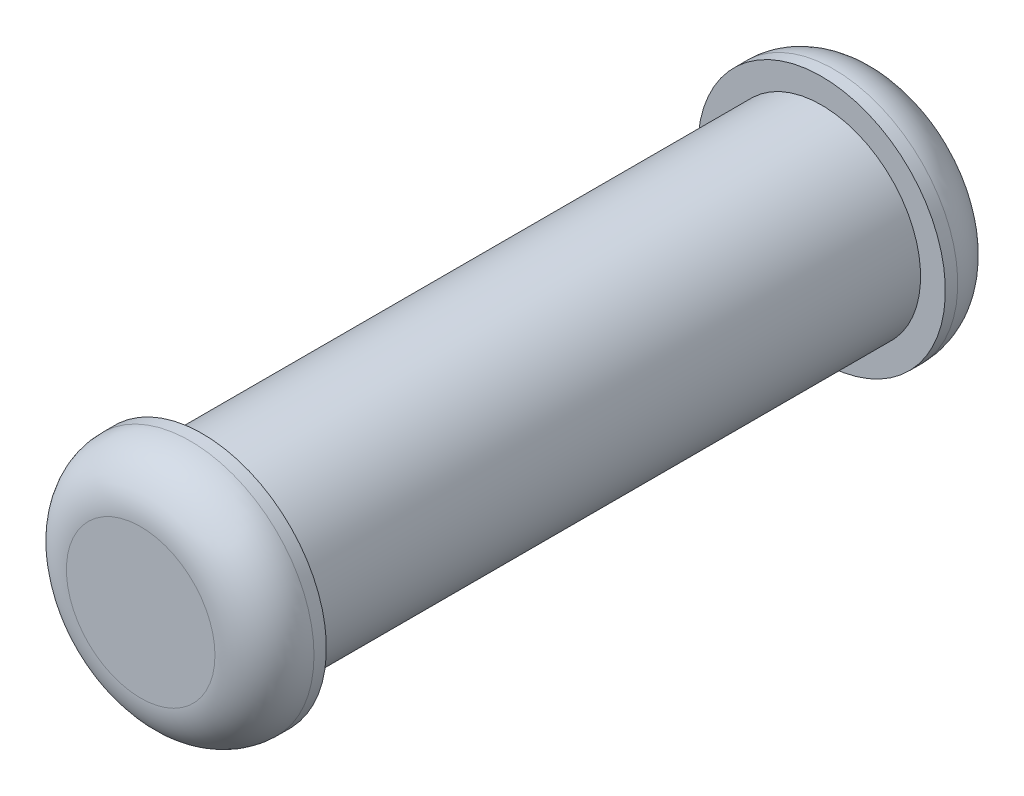
ISO-10303-21;
HEADER;
FILE_DESCRIPTION(('STEP AP214'),'2;1');
FILE_NAME('part.step','',(''),(''),'','','');
FILE_SCHEMA(('AUTOMOTIVE_DESIGN { 1 0 10303 214 1 1 1 1 }'));
ENDSEC;
DATA;
#1=APPLICATION_CONTEXT('core data for automotive mechanical design processes');
#2=APPLICATION_PROTOCOL_DEFINITION('international standard','automotive_design',2000,#1);
#3=PRODUCT_CONTEXT('',#1,'mechanical');
#4=PRODUCT('Part','Part','',(#3));
#5=PRODUCT_RELATED_PRODUCT_CATEGORY('part','',(#4));
#6=PRODUCT_DEFINITION_FORMATION('','',#4);
#7=PRODUCT_DEFINITION_CONTEXT('part definition',#1,'design');
#8=PRODUCT_DEFINITION('design','',#6,#7);
#9=PRODUCT_DEFINITION_SHAPE('','',#8);
#10=(LENGTH_UNIT() NAMED_UNIT(*) SI_UNIT(.MILLI.,.METRE.));
#11=(NAMED_UNIT(*) PLANE_ANGLE_UNIT() SI_UNIT($,.RADIAN.));
#12=(NAMED_UNIT(*) SI_UNIT($,.STERADIAN.) SOLID_ANGLE_UNIT());
#13=UNCERTAINTY_MEASURE_WITH_UNIT(LENGTH_MEASURE(1.E-05),#10,'distance_accuracy_value','');
#14=(GEOMETRIC_REPRESENTATION_CONTEXT(3) GLOBAL_UNCERTAINTY_ASSIGNED_CONTEXT((#13)) GLOBAL_UNIT_ASSIGNED_CONTEXT((#10,
#11,#12)) REPRESENTATION_CONTEXT('',''));
#15=CARTESIAN_POINT('',(0.,0.,0.));
#16=DIRECTION('',(0.,0.,1.));
#17=DIRECTION('',(1.,0.,0.));
#18=AXIS2_PLACEMENT_3D('',#15,#16,#17);
#19=CARTESIAN_POINT('',(0.,0.,1.64213562373095));
#20=DIRECTION('',(0.,0.,-1.));
#21=DIRECTION('',(-1.,0.,0.));
#22=AXIS2_PLACEMENT_3D('',#19,#20,#21);
#23=CYLINDRICAL_SURFACE('',#22,5.);
#24=CARTESIAN_POINT('',(0.,0.,-13.));
#25=DIRECTION('',(0.,0.,-1.));
#26=DIRECTION('',(-1.,0.,0.));
#27=AXIS2_PLACEMENT_3D('',#24,#25,#26);
#28=CIRCLE('',#27,5.);
#29=CARTESIAN_POINT('',(-5.,0.,-13.));
#30=VERTEX_POINT('',#29);
#31=EDGE_CURVE('E25',#30,#30,#28,.F.);
#32=ORIENTED_EDGE('',*,*,#31,.T.);
#33=EDGE_LOOP('',(#32));
#34=FACE_BOUND('',#33,.T.);
#35=CARTESIAN_POINT('',(0.,0.,-12.5));
#36=DIRECTION('',(0.,0.,-1.));
#37=DIRECTION('',(-1.,0.,0.));
#38=AXIS2_PLACEMENT_3D('',#35,#36,#37);
#39=CIRCLE('',#38,5.);
#40=CARTESIAN_POINT('',(-5.,0.,-12.5));
#41=VERTEX_POINT('',#40);
#42=EDGE_CURVE('E37',#41,#41,#39,.F.);
#43=ORIENTED_EDGE('',*,*,#42,.F.);
#44=EDGE_LOOP('',(#43));
#45=FACE_BOUND('',#44,.T.);
#46=ADVANCED_FACE('F14',(#34,#45),#23,.T.);
#47=CARTESIAN_POINT('',(0.,0.,-15.));
#48=DIRECTION('',(0.,0.,-1.));
#49=DIRECTION('',(-1.,0.,0.));
#50=AXIS2_PLACEMENT_3D('',#47,#48,#49);
#51=PLANE('',#50);
#52=CARTESIAN_POINT('',(0.,0.,-15.));
#53=DIRECTION('',(0.,0.,-1.));
#54=DIRECTION('',(-1.,0.,0.));
#55=AXIS2_PLACEMENT_3D('',#52,#53,#54);
#56=CIRCLE('',#55,3.);
#57=CARTESIAN_POINT('',(-3.,0.,-15.));
#58=VERTEX_POINT('',#57);
#59=EDGE_CURVE('E29',#58,#58,#56,.T.);
#60=ORIENTED_EDGE('',*,*,#59,.T.);
#61=EDGE_LOOP('',(#60));
#62=FACE_BOUND('',#61,.T.);
#63=ADVANCED_FACE('F65',(#62),#51,.T.);
#64=CARTESIAN_POINT('',(9.,-20.,-12.5));
#65=DIRECTION('',(0.,0.,-1.));
#66=DIRECTION('',(-1.,0.,0.));
#67=AXIS2_PLACEMENT_3D('',#64,#65,#66);
#68=PLANE('',#67);
#69=CARTESIAN_POINT('',(0.,0.,-12.5));
#70=DIRECTION('',(0.,0.,-1.));
#71=DIRECTION('',(-1.,0.,0.));
#72=AXIS2_PLACEMENT_3D('',#69,#70,#71);
#73=CIRCLE('',#72,4.);
#74=CARTESIAN_POINT('',(-4.,0.,-12.5));
#75=VERTEX_POINT('',#74);
#76=EDGE_CURVE('E34',#75,#75,#73,.F.);
#77=ORIENTED_EDGE('',*,*,#76,.F.);
#78=EDGE_LOOP('',(#77));
#79=FACE_BOUND('',#78,.T.);
#80=ORIENTED_EDGE('',*,*,#42,.T.);
#81=EDGE_LOOP('',(#80));
#82=FACE_BOUND('',#81,.T.);
#83=ADVANCED_FACE('F72',(#79,#82),#68,.F.);
#84=CARTESIAN_POINT('',(0.,0.,15.));
#85=DIRECTION('',(0.,0.,-1.));
#86=DIRECTION('',(-1.,0.,0.));
#87=AXIS2_PLACEMENT_3D('',#84,#85,#86);
#88=CYLINDRICAL_SURFACE('',#87,4.);
#89=CARTESIAN_POINT('',(0.,0.,12.5));
#90=DIRECTION('',(0.,0.,1.));
#91=DIRECTION('',(1.,0.,0.));
#92=AXIS2_PLACEMENT_3D('',#89,#90,#91);
#93=CIRCLE('',#92,4.);
#94=CARTESIAN_POINT('',(4.,0.,12.5));
#95=VERTEX_POINT('',#94);
#96=EDGE_CURVE('E40',#95,#95,#93,.T.);
#97=ORIENTED_EDGE('',*,*,#96,.F.);
#98=EDGE_LOOP('',(#97));
#99=FACE_BOUND('',#98,.T.);
#100=ORIENTED_EDGE('',*,*,#76,.T.);
#101=EDGE_LOOP('',(#100));
#102=FACE_BOUND('',#101,.T.);
#103=ADVANCED_FACE('F62',(#99,#102),#88,.T.);
#104=CARTESIAN_POINT('',(0.,0.,-1.64213562373095));
#105=DIRECTION('',(0.,0.,1.));
#106=DIRECTION('',(-1.,0.,0.));
#107=AXIS2_PLACEMENT_3D('',#104,#105,#106);
#108=CYLINDRICAL_SURFACE('',#107,5.);
#109=CARTESIAN_POINT('',(0.,0.,13.));
#110=DIRECTION('',(0.,0.,1.));
#111=DIRECTION('',(1.,0.,0.));
#112=AXIS2_PLACEMENT_3D('',#109,#110,#111);
#113=CIRCLE('',#112,5.);
#114=CARTESIAN_POINT('',(5.,0.,13.));
#115=VERTEX_POINT('',#114);
#116=EDGE_CURVE('E21',#115,#115,#113,.F.);
#117=ORIENTED_EDGE('',*,*,#116,.T.);
#118=EDGE_LOOP('',(#117));
#119=FACE_BOUND('',#118,.T.);
#120=CARTESIAN_POINT('',(0.,0.,12.5));
#121=DIRECTION('',(0.,0.,-1.));
#122=DIRECTION('',(-1.,0.,0.));
#123=AXIS2_PLACEMENT_3D('',#120,#121,#122);
#124=CIRCLE('',#123,5.);
#125=CARTESIAN_POINT('',(-5.,0.,12.5));
#126=VERTEX_POINT('',#125);
#127=EDGE_CURVE('E43',#126,#126,#124,.F.);
#128=ORIENTED_EDGE('',*,*,#127,.T.);
#129=EDGE_LOOP('',(#128));
#130=FACE_BOUND('',#129,.T.);
#131=ADVANCED_FACE('F47',(#119,#130),#108,.T.);
#132=CARTESIAN_POINT('',(9.,-20.,12.5));
#133=DIRECTION('',(0.,0.,1.));
#134=DIRECTION('',(-1.,0.,0.));
#135=AXIS2_PLACEMENT_3D('',#132,#133,#134);
#136=PLANE('',#135);
#137=ORIENTED_EDGE('',*,*,#96,.T.);
#138=EDGE_LOOP('',(#137));
#139=FACE_BOUND('',#138,.T.);
#140=ORIENTED_EDGE('',*,*,#127,.F.);
#141=EDGE_LOOP('',(#140));
#142=FACE_BOUND('',#141,.T.);
#143=ADVANCED_FACE('F49',(#139,#142),#136,.F.);
#144=CARTESIAN_POINT('',(0.,0.,15.));
#145=DIRECTION('',(0.,0.,1.));
#146=DIRECTION('',(1.,0.,0.));
#147=AXIS2_PLACEMENT_3D('',#144,#145,#146);
#148=PLANE('',#147);
#149=CARTESIAN_POINT('',(0.,0.,15.));
#150=DIRECTION('',(0.,0.,1.));
#151=DIRECTION('',(1.,0.,0.));
#152=AXIS2_PLACEMENT_3D('',#149,#150,#151);
#153=CIRCLE('',#152,3.);
#154=CARTESIAN_POINT('',(3.,0.,15.));
#155=VERTEX_POINT('',#154);
#156=EDGE_CURVE('E10',#155,#155,#153,.T.);
#157=ORIENTED_EDGE('',*,*,#156,.T.);
#158=EDGE_LOOP('',(#157));
#159=FACE_BOUND('',#158,.T.);
#160=ADVANCED_FACE('F51',(#159),#148,.T.);
#161=CARTESIAN_POINT('',(0.,0.,-13.));
#162=DIRECTION('',(0.,0.,-1.));
#163=DIRECTION('',(-1.,0.,0.));
#164=AXIS2_PLACEMENT_3D('',#161,#162,#163);
#165=TOROIDAL_SURFACE('',#164,3.,2.);
#166=ORIENTED_EDGE('',*,*,#31,.F.);
#167=EDGE_LOOP('',(#166));
#168=FACE_BOUND('',#167,.T.);
#169=ORIENTED_EDGE('',*,*,#59,.F.);
#170=EDGE_LOOP('',(#169));
#171=FACE_BOUND('',#170,.T.);
#172=ADVANCED_FACE('F60',(#168,#171),#165,.T.);
#173=CARTESIAN_POINT('',(0.,0.,13.));
#174=DIRECTION('',(0.,0.,1.));
#175=DIRECTION('',(1.,0.,0.));
#176=AXIS2_PLACEMENT_3D('',#173,#174,#175);
#177=TOROIDAL_SURFACE('',#176,3.,2.);
#178=ORIENTED_EDGE('',*,*,#156,.F.);
#179=EDGE_LOOP('',(#178));
#180=FACE_BOUND('',#179,.T.);
#181=ORIENTED_EDGE('',*,*,#116,.F.);
#182=EDGE_LOOP('',(#181));
#183=FACE_BOUND('',#182,.T.);
#184=ADVANCED_FACE('F16',(#180,#183),#177,.T.);
#185=CLOSED_SHELL('',(#46,#63,#83,#103,#131,#143,#160,#172,#184));
#186=MANIFOLD_SOLID_BREP('B1',#185);
#187=ADVANCED_BREP_SHAPE_REPRESENTATION('',(#18,#186),#14);
#188=SHAPE_DEFINITION_REPRESENTATION(#9,#187);
ENDSEC;
END-ISO-10303-21;
